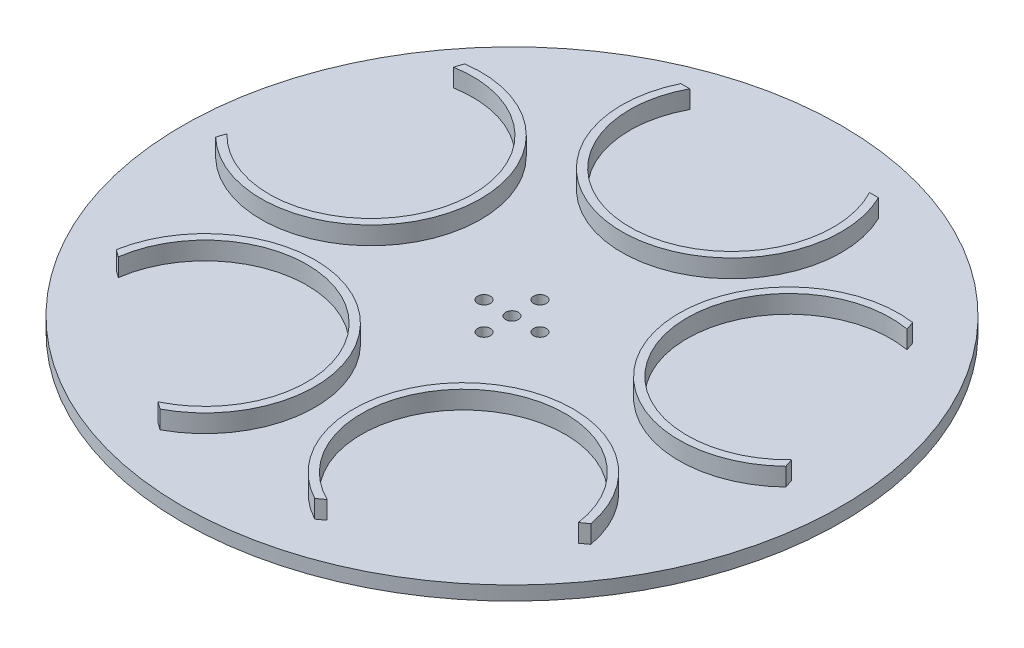
ISO-10303-21;
HEADER;
FILE_DESCRIPTION(('STEP AP214'),'2;1');
FILE_NAME('part.step','',(''),(''),'','','');
FILE_SCHEMA(('AUTOMOTIVE_DESIGN { 1 0 10303 214 1 1 1 1 }'));
ENDSEC;
DATA;
#1=APPLICATION_CONTEXT('core data for automotive mechanical design processes');
#2=APPLICATION_PROTOCOL_DEFINITION('international standard','automotive_design',2000,#1);
#3=PRODUCT_CONTEXT('',#1,'mechanical');
#4=PRODUCT('Part','Part','',(#3));
#5=PRODUCT_RELATED_PRODUCT_CATEGORY('part','',(#4));
#6=PRODUCT_DEFINITION_FORMATION('','',#4);
#7=PRODUCT_DEFINITION_CONTEXT('part definition',#1,'design');
#8=PRODUCT_DEFINITION('design','',#6,#7);
#9=PRODUCT_DEFINITION_SHAPE('','',#8);
#10=(LENGTH_UNIT() NAMED_UNIT(*) SI_UNIT(.MILLI.,.METRE.));
#11=(NAMED_UNIT(*) PLANE_ANGLE_UNIT() SI_UNIT($,.RADIAN.));
#12=(NAMED_UNIT(*) SI_UNIT($,.STERADIAN.) SOLID_ANGLE_UNIT());
#13=UNCERTAINTY_MEASURE_WITH_UNIT(LENGTH_MEASURE(1.E-05),#10,'distance_accuracy_value','');
#14=(GEOMETRIC_REPRESENTATION_CONTEXT(3) GLOBAL_UNCERTAINTY_ASSIGNED_CONTEXT((#13)) GLOBAL_UNIT_ASSIGNED_CONTEXT((#10,
#11,#12)) REPRESENTATION_CONTEXT('',''));
#15=CARTESIAN_POINT('',(0.,0.,0.));
#16=DIRECTION('',(0.,0.,1.));
#17=DIRECTION('',(1.,0.,0.));
#18=AXIS2_PLACEMENT_3D('',#15,#16,#17);
#19=CARTESIAN_POINT('',(0.,3.5,0.));
#20=DIRECTION('',(0.,-1.,0.));
#21=DIRECTION('',(0.,0.,-1.));
#22=AXIS2_PLACEMENT_3D('',#19,#20,#21);
#23=CYLINDRICAL_SURFACE('',#22,82.5);
#24=CARTESIAN_POINT('',(0.,3.5,0.));
#25=DIRECTION('',(0.,1.,0.));
#26=DIRECTION('',(0.,0.,1.));
#27=AXIS2_PLACEMENT_3D('',#24,#25,#26);
#28=CIRCLE('',#27,82.5);
#29=CARTESIAN_POINT('',(0.,3.5,82.5));
#30=VERTEX_POINT('',#29);
#31=EDGE_CURVE('E397',#30,#30,#28,.T.);
#32=ORIENTED_EDGE('',*,*,#31,.F.);
#33=EDGE_LOOP('',(#32));
#34=FACE_BOUND('',#33,.T.);
#35=CARTESIAN_POINT('',(0.,0.,0.));
#36=DIRECTION('',(0.,1.,0.));
#37=DIRECTION('',(0.,0.,1.));
#38=AXIS2_PLACEMENT_3D('',#35,#36,#37);
#39=CIRCLE('',#38,82.5);
#40=CARTESIAN_POINT('',(0.,0.,82.5));
#41=VERTEX_POINT('',#40);
#42=EDGE_CURVE('E385',#41,#41,#39,.T.);
#43=ORIENTED_EDGE('',*,*,#42,.T.);
#44=EDGE_LOOP('',(#43));
#45=FACE_BOUND('',#44,.T.);
#46=ADVANCED_FACE('F127',(#34,#45),#23,.T.);
#47=CARTESIAN_POINT('',(0.,3.5,0.));
#48=DIRECTION('',(0.,-1.,0.));
#49=DIRECTION('',(0.,0.,-1.));
#50=AXIS2_PLACEMENT_3D('',#47,#48,#49);
#51=CYLINDRICAL_SURFACE('',#50,1.60000000000153);
#52=CARTESIAN_POINT('',(0.,3.5,0.));
#53=DIRECTION('',(0.,1.,0.));
#54=DIRECTION('',(0.,0.,1.));
#55=AXIS2_PLACEMENT_3D('',#52,#53,#54);
#56=CIRCLE('',#55,1.60000000000153);
#57=CARTESIAN_POINT('',(0.,3.5,1.60000000000152));
#58=VERTEX_POINT('',#57);
#59=EDGE_CURVE('E394',#58,#58,#56,.T.);
#60=ORIENTED_EDGE('',*,*,#59,.T.);
#61=EDGE_LOOP('',(#60));
#62=FACE_BOUND('',#61,.T.);
#63=CARTESIAN_POINT('',(0.,0.,0.));
#64=DIRECTION('',(0.,1.,0.));
#65=DIRECTION('',(0.,0.,1.));
#66=AXIS2_PLACEMENT_3D('',#63,#64,#65);
#67=CIRCLE('',#66,1.60000000000153);
#68=CARTESIAN_POINT('',(0.,0.,1.60000000000152));
#69=VERTEX_POINT('',#68);
#70=EDGE_CURVE('E412',#69,#69,#67,.T.);
#71=ORIENTED_EDGE('',*,*,#70,.F.);
#72=EDGE_LOOP('',(#71));
#73=FACE_BOUND('',#72,.T.);
#74=ADVANCED_FACE('F476',(#62,#73),#51,.F.);
#75=CARTESIAN_POINT('',(0.,3.5,-7.));
#76=DIRECTION('',(0.,-1.,0.));
#77=DIRECTION('',(0.,0.,-1.));
#78=AXIS2_PLACEMENT_3D('',#75,#76,#77);
#79=CYLINDRICAL_SURFACE('',#78,1.6);
#80=CARTESIAN_POINT('',(0.,3.5,-7.));
#81=DIRECTION('',(0.,1.,0.));
#82=DIRECTION('',(0.,0.,1.));
#83=AXIS2_PLACEMENT_3D('',#80,#81,#82);
#84=CIRCLE('',#83,1.6);
#85=CARTESIAN_POINT('',(0.,3.5,-5.4));
#86=VERTEX_POINT('',#85);
#87=EDGE_CURVE('E391',#86,#86,#84,.T.);
#88=ORIENTED_EDGE('',*,*,#87,.T.);
#89=EDGE_LOOP('',(#88));
#90=FACE_BOUND('',#89,.T.);
#91=CARTESIAN_POINT('',(0.,0.,-7.));
#92=DIRECTION('',(0.,1.,0.));
#93=DIRECTION('',(0.,0.,1.));
#94=AXIS2_PLACEMENT_3D('',#91,#92,#93);
#95=CIRCLE('',#94,1.6);
#96=CARTESIAN_POINT('',(0.,0.,-5.4));
#97=VERTEX_POINT('',#96);
#98=EDGE_CURVE('E409',#97,#97,#95,.T.);
#99=ORIENTED_EDGE('',*,*,#98,.F.);
#100=EDGE_LOOP('',(#99));
#101=FACE_BOUND('',#100,.T.);
#102=ADVANCED_FACE('F482',(#90,#101),#79,.F.);
#103=CARTESIAN_POINT('',(7.,3.5,0.));
#104=DIRECTION('',(0.,-1.,0.));
#105=DIRECTION('',(0.,0.,-1.));
#106=AXIS2_PLACEMENT_3D('',#103,#104,#105);
#107=CYLINDRICAL_SURFACE('',#106,1.6);
#108=CARTESIAN_POINT('',(7.,3.5,0.));
#109=DIRECTION('',(0.,1.,0.));
#110=DIRECTION('',(0.,0.,1.));
#111=AXIS2_PLACEMENT_3D('',#108,#109,#110);
#112=CIRCLE('',#111,1.6);
#113=CARTESIAN_POINT('',(7.,3.5,1.6));
#114=VERTEX_POINT('',#113);
#115=EDGE_CURVE('E388',#114,#114,#112,.T.);
#116=ORIENTED_EDGE('',*,*,#115,.T.);
#117=EDGE_LOOP('',(#116));
#118=FACE_BOUND('',#117,.T.);
#119=CARTESIAN_POINT('',(7.,0.,0.));
#120=DIRECTION('',(0.,1.,0.));
#121=DIRECTION('',(0.,0.,1.));
#122=AXIS2_PLACEMENT_3D('',#119,#120,#121);
#123=CIRCLE('',#122,1.6);
#124=CARTESIAN_POINT('',(7.,0.,1.6));
#125=VERTEX_POINT('',#124);
#126=EDGE_CURVE('E406',#125,#125,#123,.T.);
#127=ORIENTED_EDGE('',*,*,#126,.F.);
#128=EDGE_LOOP('',(#127));
#129=FACE_BOUND('',#128,.T.);
#130=ADVANCED_FACE('F493',(#118,#129),#107,.F.);
#131=CARTESIAN_POINT('',(0.,3.5,7.));
#132=DIRECTION('',(0.,-1.,0.));
#133=DIRECTION('',(0.,0.,-1.));
#134=AXIS2_PLACEMENT_3D('',#131,#132,#133);
#135=CYLINDRICAL_SURFACE('',#134,1.6);
#136=CARTESIAN_POINT('',(0.,3.5,7.));
#137=DIRECTION('',(0.,1.,0.));
#138=DIRECTION('',(0.,0.,1.));
#139=AXIS2_PLACEMENT_3D('',#136,#137,#138);
#140=CIRCLE('',#139,1.6);
#141=CARTESIAN_POINT('',(0.,3.5,8.6));
#142=VERTEX_POINT('',#141);
#143=EDGE_CURVE('E384',#142,#142,#140,.T.);
#144=ORIENTED_EDGE('',*,*,#143,.T.);
#145=EDGE_LOOP('',(#144));
#146=FACE_BOUND('',#145,.T.);
#147=CARTESIAN_POINT('',(0.,0.,7.));
#148=DIRECTION('',(0.,1.,0.));
#149=DIRECTION('',(0.,0.,1.));
#150=AXIS2_PLACEMENT_3D('',#147,#148,#149);
#151=CIRCLE('',#150,1.6);
#152=CARTESIAN_POINT('',(0.,0.,8.6));
#153=VERTEX_POINT('',#152);
#154=EDGE_CURVE('E403',#153,#153,#151,.T.);
#155=ORIENTED_EDGE('',*,*,#154,.F.);
#156=EDGE_LOOP('',(#155));
#157=FACE_BOUND('',#156,.T.);
#158=ADVANCED_FACE('F496',(#146,#157),#135,.F.);
#159=CARTESIAN_POINT('',(-7.,3.5,0.));
#160=DIRECTION('',(0.,-1.,0.));
#161=DIRECTION('',(0.,0.,-1.));
#162=AXIS2_PLACEMENT_3D('',#159,#160,#161);
#163=CYLINDRICAL_SURFACE('',#162,1.6);
#164=CARTESIAN_POINT('',(-7.,3.5,0.));
#165=DIRECTION('',(0.,1.,0.));
#166=DIRECTION('',(0.,0.,1.));
#167=AXIS2_PLACEMENT_3D('',#164,#165,#166);
#168=CIRCLE('',#167,1.6);
#169=CARTESIAN_POINT('',(-7.,3.5,1.6));
#170=VERTEX_POINT('',#169);
#171=EDGE_CURVE('E381',#170,#170,#168,.T.);
#172=ORIENTED_EDGE('',*,*,#171,.T.);
#173=EDGE_LOOP('',(#172));
#174=FACE_BOUND('',#173,.T.);
#175=CARTESIAN_POINT('',(-7.,0.,0.));
#176=DIRECTION('',(0.,1.,0.));
#177=DIRECTION('',(0.,0.,1.));
#178=AXIS2_PLACEMENT_3D('',#175,#176,#177);
#179=CIRCLE('',#178,1.6);
#180=CARTESIAN_POINT('',(-7.,0.,1.6));
#181=VERTEX_POINT('',#180);
#182=EDGE_CURVE('E380',#181,#181,#179,.T.);
#183=ORIENTED_EDGE('',*,*,#182,.F.);
#184=EDGE_LOOP('',(#183));
#185=FACE_BOUND('',#184,.T.);
#186=ADVANCED_FACE('F129',(#174,#185),#163,.F.);
#187=CARTESIAN_POINT('',(0.,0.,0.));
#188=DIRECTION('',(0.,1.,0.));
#189=DIRECTION('',(0.,0.,1.));
#190=AXIS2_PLACEMENT_3D('',#187,#188,#189);
#191=PLANE('',#190);
#192=ORIENTED_EDGE('',*,*,#182,.T.);
#193=EDGE_LOOP('',(#192));
#194=FACE_BOUND('',#193,.T.);
#195=ORIENTED_EDGE('',*,*,#154,.T.);
#196=EDGE_LOOP('',(#195));
#197=FACE_BOUND('',#196,.T.);
#198=ORIENTED_EDGE('',*,*,#126,.T.);
#199=EDGE_LOOP('',(#198));
#200=FACE_BOUND('',#199,.T.);
#201=ORIENTED_EDGE('',*,*,#98,.T.);
#202=EDGE_LOOP('',(#201));
#203=FACE_BOUND('',#202,.T.);
#204=ORIENTED_EDGE('',*,*,#70,.T.);
#205=EDGE_LOOP('',(#204));
#206=FACE_BOUND('',#205,.T.);
#207=ORIENTED_EDGE('',*,*,#42,.F.);
#208=EDGE_LOOP('',(#207));
#209=FACE_BOUND('',#208,.T.);
#210=ADVANCED_FACE('F488',(#194,#197,#200,#203,#206,#209),#191,.F.);
#211=CARTESIAN_POINT('',(0.,3.5,0.));
#212=DIRECTION('',(0.,1.,0.));
#213=DIRECTION('',(0.,0.,1.));
#214=AXIS2_PLACEMENT_3D('',#211,#212,#213);
#215=PLANE('',#214);
#216=CARTESIAN_POINT('',(0.,3.5,-55.));
#217=DIRECTION('',(0.,1.,0.));
#218=DIRECTION('',(0.,0.,1.));
#219=AXIS2_PLACEMENT_3D('',#216,#217,#218);
#220=CIRCLE('',#219,27.5);
#221=CARTESIAN_POINT('',(24.7436860633172,3.5,-67.));
#222=VERTEX_POINT('',#221);
#223=CARTESIAN_POINT('',(-24.7436860633172,3.5,-67.));
#224=VERTEX_POINT('',#223);
#225=EDGE_CURVE('E135',#222,#224,#220,.F.);
#226=ORIENTED_EDGE('',*,*,#225,.T.);
#227=DIRECTION('',(1.,0.,0.));
#228=VECTOR('',#227,1.);
#229=CARTESIAN_POINT('',(4.14412603583616E-13,3.5,-66.9999999999999));
#230=LINE('',#229,#228);
#231=CARTESIAN_POINT('',(-22.5,3.5,-67.));
#232=VERTEX_POINT('',#231);
#233=EDGE_CURVE('E12',#224,#232,#230,.T.);
#234=ORIENTED_EDGE('',*,*,#233,.T.);
#235=CARTESIAN_POINT('',(0.,3.5,-55.));
#236=DIRECTION('',(0.,1.,0.));
#237=DIRECTION('',(0.,0.,1.));
#238=AXIS2_PLACEMENT_3D('',#235,#236,#237);
#239=CIRCLE('',#238,25.5);
#240=CARTESIAN_POINT('',(22.5,3.5,-67.));
#241=VERTEX_POINT('',#240);
#242=EDGE_CURVE('E267',#241,#232,#239,.F.);
#243=ORIENTED_EDGE('',*,*,#242,.F.);
#244=DIRECTION('',(-1.,0.,0.));
#245=VECTOR('',#244,1.);
#246=CARTESIAN_POINT('',(-4.14412603583616E-13,3.5,-66.9999999999999));
#247=LINE('',#246,#245);
#248=EDGE_CURVE('E145',#222,#241,#247,.T.);
#249=ORIENTED_EDGE('',*,*,#248,.F.);
#250=EDGE_LOOP('',(#226,#234,#243,#249));
#251=FACE_BOUND('',#250,.T.);
#252=CARTESIAN_POINT('',(52.308108396234,3.5,-16.9959346906204));
#253=DIRECTION('',(0.,1.,0.));
#254=DIRECTION('',(0.,0.,1.));
#255=AXIS2_PLACEMENT_3D('',#252,#253,#254);
#256=CIRCLE('',#255,27.5);
#257=CARTESIAN_POINT('',(71.3670060888188,3.5,2.82850524456022));
#258=VERTEX_POINT('',#257);
#259=CARTESIAN_POINT('',(56.0745670947332,3.5,-44.2367824907991));
#260=VERTEX_POINT('',#259);
#261=EDGE_CURVE('E452',#258,#260,#256,.F.);
#262=ORIENTED_EDGE('',*,*,#261,.T.);
#263=DIRECTION('',(0.309016994374912,0.,0.951056516295165));
#264=VECTOR('',#263,1.);
#265=CARTESIAN_POINT('',(63.720786591776,3.5,-20.7041386231191));
#266=LINE('',#265,#264);
#267=CARTESIAN_POINT('',(56.7679042183403,3.5,-42.1029102397606));
#268=VERTEX_POINT('',#267);
#269=EDGE_CURVE('E454',#260,#268,#266,.T.);
#270=ORIENTED_EDGE('',*,*,#269,.T.);
#271=CARTESIAN_POINT('',(52.308108396234,3.5,-16.9959346906204));
#272=DIRECTION('',(0.,1.,0.));
#273=DIRECTION('',(0.,0.,1.));
#274=AXIS2_PLACEMENT_3D('',#271,#272,#273);
#275=CIRCLE('',#274,25.5);
#276=CARTESIAN_POINT('',(70.6736689652116,3.5,0.694632993521731));
#277=VERTEX_POINT('',#276);
#278=EDGE_CURVE('E446',#277,#268,#275,.F.);
#279=ORIENTED_EDGE('',*,*,#278,.F.);
#280=DIRECTION('',(-0.309016994374924,0.,-0.951056516295161));
#281=VECTOR('',#280,1.);
#282=CARTESIAN_POINT('',(63.7207865917757,3.5,-20.7041386231199));
#283=LINE('',#282,#281);
#284=EDGE_CURVE('E449',#258,#277,#283,.T.);
#285=ORIENTED_EDGE('',*,*,#284,.F.);
#286=EDGE_LOOP('',(#262,#270,#279,#285));
#287=FACE_BOUND('',#286,.T.);
#288=CARTESIAN_POINT('',(-32.3281888760903,3.5,44.495934690619));
#289=DIRECTION('',(0.,1.,0.));
#290=DIRECTION('',(0.,0.,1.));
#291=AXIS2_PLACEMENT_3D('',#288,#289,#290);
#292=CIRCLE('',#291,27.5);
#293=CARTESIAN_POINT('',(-59.3996744323017,3.5,39.6601648677431));
#294=VERTEX_POINT('',#293);
#295=CARTESIAN_POINT('',(-19.3635493749001,3.5,68.7481123784923));
#296=VERTEX_POINT('',#295);
#297=EDGE_CURVE('E442',#294,#296,#292,.F.);
#298=ORIENTED_EDGE('',*,*,#297,.T.);
#299=DIRECTION('',(-0.809016994374885,0.,-0.587785252292558));
#300=VECTOR('',#299,1.);
#301=CARTESIAN_POINT('',(-39.3816119036013,3.5,54.2041386231172));
#302=LINE('',#301,#300);
#303=CARTESIAN_POINT('',(-21.1787295301658,3.5,67.4293067997001));
#304=VERTEX_POINT('',#303);
#305=EDGE_CURVE('E444',#296,#304,#302,.T.);
#306=ORIENTED_EDGE('',*,*,#305,.T.);
#307=CARTESIAN_POINT('',(-32.3281888760903,3.5,44.495934690619));
#308=DIRECTION('',(0.,1.,0.));
#309=DIRECTION('',(0.,0.,1.));
#310=AXIS2_PLACEMENT_3D('',#307,#308,#309);
#311=CIRCLE('',#310,25.5);
#312=CARTESIAN_POINT('',(-57.584494277036,3.5,40.9789704465353));
#313=VERTEX_POINT('',#312);
#314=EDGE_CURVE('E436',#313,#304,#311,.F.);
#315=ORIENTED_EDGE('',*,*,#314,.F.);
#316=DIRECTION('',(0.809016994374897,0.,0.587785252292542));
#317=VECTOR('',#316,1.);
#318=CARTESIAN_POINT('',(-39.3816119036002,3.5,54.2041386231179));
#319=LINE('',#318,#317);
#320=EDGE_CURVE('E439',#294,#313,#319,.T.);
#321=ORIENTED_EDGE('',*,*,#320,.F.);
#322=EDGE_LOOP('',(#298,#306,#315,#321));
#323=FACE_BOUND('',#322,.T.);
#324=CARTESIAN_POINT('',(-52.3081083962313,3.5,-16.9959346906288));
#325=DIRECTION('',(0.,1.,0.));
#326=DIRECTION('',(0.,0.,1.));
#327=AXIS2_PLACEMENT_3D('',#324,#325,#326);
#328=CIRCLE('',#327,27.5);
#329=CARTESIAN_POINT('',(-56.0745670947261,3.5,-44.2367824908081));
#330=VERTEX_POINT('',#329);
#331=CARTESIAN_POINT('',(-71.3670060888192,3.5,2.82850524454883));
#332=VERTEX_POINT('',#331);
#333=EDGE_CURVE('E432',#330,#332,#328,.F.);
#334=ORIENTED_EDGE('',*,*,#333,.T.);
#335=DIRECTION('',(0.309016994375073,0.,-0.951056516295113));
#336=VECTOR('',#335,1.);
#337=CARTESIAN_POINT('',(-63.7207865917725,3.5,-20.7041386231299));
#338=LINE('',#337,#336);
#339=CARTESIAN_POINT('',(-70.6736689652117,3.5,0.694632993510445));
#340=VERTEX_POINT('',#339);
#341=EDGE_CURVE('E434',#332,#340,#338,.T.);
#342=ORIENTED_EDGE('',*,*,#341,.T.);
#343=CARTESIAN_POINT('',(-52.3081083962313,3.5,-16.9959346906288));
#344=DIRECTION('',(0.,1.,0.));
#345=DIRECTION('',(0.,0.,1.));
#346=AXIS2_PLACEMENT_3D('',#343,#344,#345);
#347=CIRCLE('',#346,25.5);
#348=CARTESIAN_POINT('',(-56.7679042183336,3.5,-42.1029102397697));
#349=VERTEX_POINT('',#348);
#350=EDGE_CURVE('E426',#349,#340,#347,.F.);
#351=ORIENTED_EDGE('',*,*,#350,.F.);
#352=DIRECTION('',(-0.309016994375063,0.,0.951056516295116));
#353=VECTOR('',#352,1.);
#354=CARTESIAN_POINT('',(-63.7207865917727,3.5,-20.7041386231291));
#355=LINE('',#354,#353);
#356=EDGE_CURVE('E429',#330,#349,#355,.T.);
#357=ORIENTED_EDGE('',*,*,#356,.F.);
#358=EDGE_LOOP('',(#334,#342,#351,#357));
#359=FACE_BOUND('',#358,.T.);
#360=CARTESIAN_POINT('',(32.3281888760832,3.5,44.4959346906242));
#361=DIRECTION('',(0.,1.,0.));
#362=DIRECTION('',(0.,0.,1.));
#363=AXIS2_PLACEMENT_3D('',#360,#361,#362);
#364=CIRCLE('',#363,25.5);
#365=CARTESIAN_POINT('',(21.1787295301551,3.5,67.4293067997035));
#366=VERTEX_POINT('',#365);
#367=CARTESIAN_POINT('',(57.5844942770294,3.5,40.9789704465445));
#368=VERTEX_POINT('',#367);
#369=EDGE_CURVE('E423',#366,#368,#364,.F.);
#370=ORIENTED_EDGE('',*,*,#369,.F.);
#371=DIRECTION('',(0.809016994374984,0.,-0.587785252292423));
#372=VECTOR('',#371,1.);
#373=CARTESIAN_POINT('',(39.3816119035923,3.5,54.2041386231239));
#374=LINE('',#373,#372);
#375=CARTESIAN_POINT('',(19.3635493748891,3.5,68.7481123784954));
#376=VERTEX_POINT('',#375);
#377=EDGE_CURVE('E400',#376,#366,#374,.T.);
#378=ORIENTED_EDGE('',*,*,#377,.F.);
#379=CARTESIAN_POINT('',(32.3281888760832,3.5,44.4959346906242));
#380=DIRECTION('',(0.,1.,0.));
#381=DIRECTION('',(0.,0.,1.));
#382=AXIS2_PLACEMENT_3D('',#379,#380,#381);
#383=CIRCLE('',#382,27.5);
#384=CARTESIAN_POINT('',(59.3996744322954,3.5,39.6601648677526));
#385=VERTEX_POINT('',#384);
#386=EDGE_CURVE('E419',#376,#385,#383,.F.);
#387=ORIENTED_EDGE('',*,*,#386,.T.);
#388=DIRECTION('',(-0.809016994374987,0.,0.587785252292419));
#389=VECTOR('',#388,1.);
#390=CARTESIAN_POINT('',(39.381611903592,3.5,54.2041386231241));
#391=LINE('',#390,#389);
#392=EDGE_CURVE('E421',#385,#368,#391,.T.);
#393=ORIENTED_EDGE('',*,*,#392,.T.);
#394=EDGE_LOOP('',(#370,#378,#387,#393));
#395=FACE_BOUND('',#394,.T.);
#396=ORIENTED_EDGE('',*,*,#171,.F.);
#397=EDGE_LOOP('',(#396));
#398=FACE_BOUND('',#397,.T.);
#399=ORIENTED_EDGE('',*,*,#143,.F.);
#400=EDGE_LOOP('',(#399));
#401=FACE_BOUND('',#400,.T.);
#402=ORIENTED_EDGE('',*,*,#115,.F.);
#403=EDGE_LOOP('',(#402));
#404=FACE_BOUND('',#403,.T.);
#405=ORIENTED_EDGE('',*,*,#87,.F.);
#406=EDGE_LOOP('',(#405));
#407=FACE_BOUND('',#406,.T.);
#408=ORIENTED_EDGE('',*,*,#59,.F.);
#409=EDGE_LOOP('',(#408));
#410=FACE_BOUND('',#409,.T.);
#411=ORIENTED_EDGE('',*,*,#31,.T.);
#412=EDGE_LOOP('',(#411));
#413=FACE_BOUND('',#412,.T.);
#414=ADVANCED_FACE('F510',(#251,#287,#323,#359,#395,#398,#401,#404,#407,#410,#413),#215,.T.);
#415=CARTESIAN_POINT('',(32.3281888760832,8.,44.4959346906242));
#416=DIRECTION('',(0.,-1.,0.));
#417=DIRECTION('',(0.,0.,-1.));
#418=AXIS2_PLACEMENT_3D('',#415,#416,#417);
#419=CYLINDRICAL_SURFACE('',#418,25.5);
#420=DIRECTION('',(0.,-1.,0.));
#421=VECTOR('',#420,1.);
#422=CARTESIAN_POINT('',(21.1787295301551,8.,67.4293067997035));
#423=LINE('',#422,#421);
#424=CARTESIAN_POINT('',(21.1787295301551,8.,67.4293067997035));
#425=VERTEX_POINT('',#424);
#426=EDGE_CURVE('E368',#425,#366,#423,.T.);
#427=ORIENTED_EDGE('',*,*,#426,.T.);
#428=ORIENTED_EDGE('',*,*,#369,.T.);
#429=DIRECTION('',(0.,-1.,0.));
#430=VECTOR('',#429,1.);
#431=CARTESIAN_POINT('',(57.5844942770294,8.,40.9789704465445));
#432=LINE('',#431,#430);
#433=CARTESIAN_POINT('',(57.5844942770294,8.,40.9789704465445));
#434=VERTEX_POINT('',#433);
#435=EDGE_CURVE('E377',#434,#368,#432,.T.);
#436=ORIENTED_EDGE('',*,*,#435,.F.);
#437=CARTESIAN_POINT('',(32.3281888760832,8.,44.4959346906242));
#438=DIRECTION('',(0.,1.,0.));
#439=DIRECTION('',(0.,0.,1.));
#440=AXIS2_PLACEMENT_3D('',#437,#438,#439);
#441=CIRCLE('',#440,25.5);
#442=EDGE_CURVE('E358',#434,#425,#441,.T.);
#443=ORIENTED_EDGE('',*,*,#442,.T.);
#444=EDGE_LOOP('',(#427,#428,#436,#443));
#445=FACE_BOUND('',#444,.T.);
#446=ADVANCED_FACE('F525',(#445),#419,.F.);
#447=CARTESIAN_POINT('',(39.381611903592,8.,54.2041386231241));
#448=DIRECTION('',(-0.587785252292419,0.,-0.809016994374987));
#449=DIRECTION('',(-0.809016994374987,0.,0.587785252292419));
#450=AXIS2_PLACEMENT_3D('',#447,#448,#449);
#451=PLANE('',#450);
#452=ORIENTED_EDGE('',*,*,#392,.F.);
#453=DIRECTION('',(0.,-1.,0.));
#454=VECTOR('',#453,1.);
#455=CARTESIAN_POINT('',(59.3996744322954,8.,39.6601648677526));
#456=LINE('',#455,#454);
#457=CARTESIAN_POINT('',(59.3996744322954,8.,39.6601648677526));
#458=VERTEX_POINT('',#457);
#459=EDGE_CURVE('E374',#458,#385,#456,.T.);
#460=ORIENTED_EDGE('',*,*,#459,.F.);
#461=DIRECTION('',(0.809016994374987,0.,-0.587785252292419));
#462=VECTOR('',#461,1.);
#463=CARTESIAN_POINT('',(39.381611903592,8.,54.2041386231241));
#464=LINE('',#463,#462);
#465=EDGE_CURVE('E361',#434,#458,#464,.T.);
#466=ORIENTED_EDGE('',*,*,#465,.F.);
#467=ORIENTED_EDGE('',*,*,#435,.T.);
#468=EDGE_LOOP('',(#452,#460,#466,#467));
#469=FACE_BOUND('',#468,.T.);
#470=ADVANCED_FACE('F531',(#469),#451,.F.);
#471=CARTESIAN_POINT('',(32.3281888760832,8.,44.4959346906242));
#472=DIRECTION('',(0.,-1.,0.));
#473=DIRECTION('',(0.,0.,-1.));
#474=AXIS2_PLACEMENT_3D('',#471,#472,#473);
#475=CYLINDRICAL_SURFACE('',#474,27.5);
#476=ORIENTED_EDGE('',*,*,#386,.F.);
#477=DIRECTION('',(0.,-1.,0.));
#478=VECTOR('',#477,1.);
#479=CARTESIAN_POINT('',(19.3635493748892,8.,68.7481123784954));
#480=LINE('',#479,#478);
#481=CARTESIAN_POINT('',(19.3635493748892,8.,68.7481123784954));
#482=VERTEX_POINT('',#481);
#483=EDGE_CURVE('E371',#482,#376,#480,.T.);
#484=ORIENTED_EDGE('',*,*,#483,.F.);
#485=CARTESIAN_POINT('',(32.3281888760832,8.,44.4959346906242));
#486=DIRECTION('',(0.,1.,0.));
#487=DIRECTION('',(0.,0.,1.));
#488=AXIS2_PLACEMENT_3D('',#485,#486,#487);
#489=CIRCLE('',#488,27.5);
#490=EDGE_CURVE('E363',#458,#482,#489,.T.);
#491=ORIENTED_EDGE('',*,*,#490,.F.);
#492=ORIENTED_EDGE('',*,*,#459,.T.);
#493=EDGE_LOOP('',(#476,#484,#491,#492));
#494=FACE_BOUND('',#493,.T.);
#495=ADVANCED_FACE('F538',(#494),#475,.T.);
#496=CARTESIAN_POINT('',(39.3816119035923,8.,54.2041386231239));
#497=DIRECTION('',(0.587785252292423,0.,0.809016994374984));
#498=DIRECTION('',(0.809016994374984,0.,-0.587785252292423));
#499=AXIS2_PLACEMENT_3D('',#496,#497,#498);
#500=PLANE('',#499);
#501=ORIENTED_EDGE('',*,*,#483,.T.);
#502=ORIENTED_EDGE('',*,*,#377,.T.);
#503=ORIENTED_EDGE('',*,*,#426,.F.);
#504=DIRECTION('',(-0.809016994374984,0.,0.587785252292423));
#505=VECTOR('',#504,1.);
#506=CARTESIAN_POINT('',(39.3816119035923,8.,54.2041386231239));
#507=LINE('',#506,#505);
#508=EDGE_CURVE('E365',#425,#482,#507,.T.);
#509=ORIENTED_EDGE('',*,*,#508,.T.);
#510=EDGE_LOOP('',(#501,#502,#503,#509));
#511=FACE_BOUND('',#510,.T.);
#512=ADVANCED_FACE('F542',(#511),#500,.T.);
#513=CARTESIAN_POINT('',(0.,8.,0.));
#514=DIRECTION('',(0.,1.,0.));
#515=DIRECTION('',(0.,0.,1.));
#516=AXIS2_PLACEMENT_3D('',#513,#514,#515);
#517=PLANE('',#516);
#518=ORIENTED_EDGE('',*,*,#442,.F.);
#519=ORIENTED_EDGE('',*,*,#465,.T.);
#520=ORIENTED_EDGE('',*,*,#490,.T.);
#521=ORIENTED_EDGE('',*,*,#508,.F.);
#522=EDGE_LOOP('',(#518,#519,#520,#521));
#523=FACE_BOUND('',#522,.T.);
#524=ADVANCED_FACE('F546',(#523),#517,.T.);
#525=CARTESIAN_POINT('',(-70.6736689652117,8.,0.694632993510448));
#526=DIRECTION('',(0.951056516295113,0.,0.309016994375073));
#527=DIRECTION('',(0.309016994375073,0.,-0.951056516295113));
#528=AXIS2_PLACEMENT_3D('',#525,#526,#527);
#529=PLANE('',#528);
#530=ORIENTED_EDGE('',*,*,#341,.F.);
#531=DIRECTION('',(0.,-1.,0.));
#532=VECTOR('',#531,1.);
#533=CARTESIAN_POINT('',(-71.3670060888192,8.,2.82850524454883));
#534=LINE('',#533,#532);
#535=CARTESIAN_POINT('',(-71.3670060888192,8.,2.82850524454883));
#536=VERTEX_POINT('',#535);
#537=EDGE_CURVE('E335',#536,#332,#534,.T.);
#538=ORIENTED_EDGE('',*,*,#537,.F.);
#539=DIRECTION('',(-0.309016994375073,0.,0.951056516295113));
#540=VECTOR('',#539,1.);
#541=CARTESIAN_POINT('',(-70.6736689652117,8.,0.694632993510448));
#542=LINE('',#541,#540);
#543=CARTESIAN_POINT('',(-70.6736689652117,8.,0.694632993510445));
#544=VERTEX_POINT('',#543);
#545=EDGE_CURVE('E355',#544,#536,#542,.T.);
#546=ORIENTED_EDGE('',*,*,#545,.F.);
#547=DIRECTION('',(0.,-1.,0.));
#548=VECTOR('',#547,1.);
#549=CARTESIAN_POINT('',(-70.6736689652117,8.,0.694632993510445));
#550=LINE('',#549,#548);
#551=EDGE_CURVE('E344',#544,#340,#550,.T.);
#552=ORIENTED_EDGE('',*,*,#551,.T.);
#553=EDGE_LOOP('',(#530,#538,#546,#552));
#554=FACE_BOUND('',#553,.T.);
#555=ADVANCED_FACE('F550',(#554),#529,.F.);
#556=CARTESIAN_POINT('',(-52.3081083962313,8.,-16.9959346906288));
#557=DIRECTION('',(0.,-1.,0.));
#558=DIRECTION('',(0.,0.,-1.));
#559=AXIS2_PLACEMENT_3D('',#556,#557,#558);
#560=CYLINDRICAL_SURFACE('',#559,27.5);
#561=ORIENTED_EDGE('',*,*,#333,.F.);
#562=DIRECTION('',(0.,-1.,0.));
#563=VECTOR('',#562,1.);
#564=CARTESIAN_POINT('',(-56.0745670947261,8.,-44.2367824908081));
#565=LINE('',#564,#563);
#566=CARTESIAN_POINT('',(-56.0745670947261,8.,-44.2367824908081));
#567=VERTEX_POINT('',#566);
#568=EDGE_CURVE('E338',#567,#330,#565,.T.);
#569=ORIENTED_EDGE('',*,*,#568,.F.);
#570=CARTESIAN_POINT('',(-52.3081083962313,8.,-16.9959346906288));
#571=DIRECTION('',(0.,1.,0.));
#572=DIRECTION('',(0.,0.,1.));
#573=AXIS2_PLACEMENT_3D('',#570,#571,#572);
#574=CIRCLE('',#573,27.5);
#575=EDGE_CURVE('E353',#536,#567,#574,.T.);
#576=ORIENTED_EDGE('',*,*,#575,.F.);
#577=ORIENTED_EDGE('',*,*,#537,.T.);
#578=EDGE_LOOP('',(#561,#569,#576,#577));
#579=FACE_BOUND('',#578,.T.);
#580=ADVANCED_FACE('F564',(#579),#560,.T.);
#581=CARTESIAN_POINT('',(-56.7679042183336,8.,-42.1029102397697));
#582=DIRECTION('',(-0.951056516295116,0.,-0.309016994375063));
#583=DIRECTION('',(-0.309016994375063,0.,0.951056516295116));
#584=AXIS2_PLACEMENT_3D('',#581,#582,#583);
#585=PLANE('',#584);
#586=ORIENTED_EDGE('',*,*,#568,.T.);
#587=ORIENTED_EDGE('',*,*,#356,.T.);
#588=DIRECTION('',(0.,-1.,0.));
#589=VECTOR('',#588,1.);
#590=CARTESIAN_POINT('',(-56.7679042183336,8.,-42.1029102397697));
#591=LINE('',#590,#589);
#592=CARTESIAN_POINT('',(-56.7679042183336,8.,-42.1029102397697));
#593=VERTEX_POINT('',#592);
#594=EDGE_CURVE('E341',#593,#349,#591,.T.);
#595=ORIENTED_EDGE('',*,*,#594,.F.);
#596=DIRECTION('',(0.309016994375063,0.,-0.951056516295116));
#597=VECTOR('',#596,1.);
#598=CARTESIAN_POINT('',(-56.7679042183336,8.,-42.1029102397697));
#599=LINE('',#598,#597);
#600=EDGE_CURVE('E350',#593,#567,#599,.T.);
#601=ORIENTED_EDGE('',*,*,#600,.T.);
#602=EDGE_LOOP('',(#586,#587,#595,#601));
#603=FACE_BOUND('',#602,.T.);
#604=ADVANCED_FACE('F560',(#603),#585,.T.);
#605=CARTESIAN_POINT('',(-52.3081083962313,8.,-16.9959346906288));
#606=DIRECTION('',(0.,-1.,0.));
#607=DIRECTION('',(0.,0.,-1.));
#608=AXIS2_PLACEMENT_3D('',#605,#606,#607);
#609=CYLINDRICAL_SURFACE('',#608,25.5);
#610=ORIENTED_EDGE('',*,*,#594,.T.);
#611=ORIENTED_EDGE('',*,*,#350,.T.);
#612=ORIENTED_EDGE('',*,*,#551,.F.);
#613=CARTESIAN_POINT('',(-52.3081083962313,8.,-16.9959346906288));
#614=DIRECTION('',(0.,1.,0.));
#615=DIRECTION('',(0.,0.,1.));
#616=AXIS2_PLACEMENT_3D('',#613,#614,#615);
#617=CIRCLE('',#616,25.5);
#618=EDGE_CURVE('E347',#544,#593,#617,.T.);
#619=ORIENTED_EDGE('',*,*,#618,.T.);
#620=EDGE_LOOP('',(#610,#611,#612,#619));
#621=FACE_BOUND('',#620,.T.);
#622=ADVANCED_FACE('F556',(#621),#609,.F.);
#623=CARTESIAN_POINT('',(-52.3081083962313,8.,-16.9959346906288));
#624=DIRECTION('',(0.,1.,0.));
#625=DIRECTION('',(0.,0.,1.));
#626=AXIS2_PLACEMENT_3D('',#623,#624,#625);
#627=PLANE('',#626);
#628=ORIENTED_EDGE('',*,*,#545,.T.);
#629=ORIENTED_EDGE('',*,*,#575,.T.);
#630=ORIENTED_EDGE('',*,*,#600,.F.);
#631=ORIENTED_EDGE('',*,*,#618,.F.);
#632=EDGE_LOOP('',(#628,#629,#630,#631));
#633=FACE_BOUND('',#632,.T.);
#634=ADVANCED_FACE('F552',(#633),#627,.T.);
#635=CARTESIAN_POINT('',(-21.1787295301658,8.,67.4293067997001));
#636=DIRECTION('',(0.587785252292559,0.,-0.809016994374886));
#637=DIRECTION('',(-0.809016994374885,0.,-0.587785252292558));
#638=AXIS2_PLACEMENT_3D('',#635,#636,#637);
#639=PLANE('',#638);
#640=ORIENTED_EDGE('',*,*,#305,.F.);
#641=DIRECTION('',(0.,-1.,0.));
#642=VECTOR('',#641,1.);
#643=CARTESIAN_POINT('',(-19.3635493749001,8.,68.7481123784923));
#644=LINE('',#643,#642);
#645=CARTESIAN_POINT('',(-19.3635493749001,8.,68.7481123784923));
#646=VERTEX_POINT('',#645);
#647=EDGE_CURVE('E312',#646,#296,#644,.T.);
#648=ORIENTED_EDGE('',*,*,#647,.F.);
#649=DIRECTION('',(0.809016994374886,0.,0.587785252292559));
#650=VECTOR('',#649,1.);
#651=CARTESIAN_POINT('',(-21.1787295301658,8.,67.4293067997001));
#652=LINE('',#651,#650);
#653=CARTESIAN_POINT('',(-21.1787295301658,8.,67.4293067997001));
#654=VERTEX_POINT('',#653);
#655=EDGE_CURVE('E332',#654,#646,#652,.T.);
#656=ORIENTED_EDGE('',*,*,#655,.F.);
#657=DIRECTION('',(0.,-1.,0.));
#658=VECTOR('',#657,1.);
#659=CARTESIAN_POINT('',(-21.1787295301658,8.,67.4293067997001));
#660=LINE('',#659,#658);
#661=EDGE_CURVE('E321',#654,#304,#660,.T.);
#662=ORIENTED_EDGE('',*,*,#661,.T.);
#663=EDGE_LOOP('',(#640,#648,#656,#662));
#664=FACE_BOUND('',#663,.T.);
#665=ADVANCED_FACE('F555',(#664),#639,.F.);
#666=CARTESIAN_POINT('',(-32.3281888760903,8.,44.495934690619));
#667=DIRECTION('',(0.,-1.,0.));
#668=DIRECTION('',(0.,0.,-1.));
#669=AXIS2_PLACEMENT_3D('',#666,#667,#668);
#670=CYLINDRICAL_SURFACE('',#669,27.5);
#671=ORIENTED_EDGE('',*,*,#297,.F.);
#672=DIRECTION('',(0.,-1.,0.));
#673=VECTOR('',#672,1.);
#674=CARTESIAN_POINT('',(-59.3996744323017,8.,39.6601648677432));
#675=LINE('',#674,#673);
#676=CARTESIAN_POINT('',(-59.3996744323017,8.,39.6601648677432));
#677=VERTEX_POINT('',#676);
#678=EDGE_CURVE('E315',#677,#294,#675,.T.);
#679=ORIENTED_EDGE('',*,*,#678,.F.);
#680=CARTESIAN_POINT('',(-32.3281888760903,8.,44.495934690619));
#681=DIRECTION('',(0.,1.,0.));
#682=DIRECTION('',(0.,0.,1.));
#683=AXIS2_PLACEMENT_3D('',#680,#681,#682);
#684=CIRCLE('',#683,27.5);
#685=EDGE_CURVE('E330',#646,#677,#684,.T.);
#686=ORIENTED_EDGE('',*,*,#685,.F.);
#687=ORIENTED_EDGE('',*,*,#647,.T.);
#688=EDGE_LOOP('',(#671,#679,#686,#687));
#689=FACE_BOUND('',#688,.T.);
#690=ADVANCED_FACE('F584',(#689),#670,.T.);
#691=CARTESIAN_POINT('',(-57.584494277036,8.,40.9789704465353));
#692=DIRECTION('',(-0.587785252292542,0.,0.809016994374897));
#693=DIRECTION('',(0.809016994374897,0.,0.587785252292542));
#694=AXIS2_PLACEMENT_3D('',#691,#692,#693);
#695=PLANE('',#694);
#696=ORIENTED_EDGE('',*,*,#678,.T.);
#697=ORIENTED_EDGE('',*,*,#320,.T.);
#698=DIRECTION('',(0.,-1.,0.));
#699=VECTOR('',#698,1.);
#700=CARTESIAN_POINT('',(-57.584494277036,8.,40.9789704465353));
#701=LINE('',#700,#699);
#702=CARTESIAN_POINT('',(-57.584494277036,8.,40.9789704465353));
#703=VERTEX_POINT('',#702);
#704=EDGE_CURVE('E318',#703,#313,#701,.T.);
#705=ORIENTED_EDGE('',*,*,#704,.F.);
#706=DIRECTION('',(-0.809016994374897,0.,-0.587785252292542));
#707=VECTOR('',#706,1.);
#708=CARTESIAN_POINT('',(-57.584494277036,8.,40.9789704465353));
#709=LINE('',#708,#707);
#710=EDGE_CURVE('E327',#703,#677,#709,.T.);
#711=ORIENTED_EDGE('',*,*,#710,.T.);
#712=EDGE_LOOP('',(#696,#697,#705,#711));
#713=FACE_BOUND('',#712,.T.);
#714=ADVANCED_FACE('F580',(#713),#695,.T.);
#715=CARTESIAN_POINT('',(-32.3281888760903,8.,44.495934690619));
#716=DIRECTION('',(0.,-1.,0.));
#717=DIRECTION('',(0.,0.,-1.));
#718=AXIS2_PLACEMENT_3D('',#715,#716,#717);
#719=CYLINDRICAL_SURFACE('',#718,25.5);
#720=ORIENTED_EDGE('',*,*,#704,.T.);
#721=ORIENTED_EDGE('',*,*,#314,.T.);
#722=ORIENTED_EDGE('',*,*,#661,.F.);
#723=CARTESIAN_POINT('',(-32.3281888760903,8.,44.495934690619));
#724=DIRECTION('',(0.,1.,0.));
#725=DIRECTION('',(0.,0.,1.));
#726=AXIS2_PLACEMENT_3D('',#723,#724,#725);
#727=CIRCLE('',#726,25.5);
#728=EDGE_CURVE('E324',#654,#703,#727,.T.);
#729=ORIENTED_EDGE('',*,*,#728,.T.);
#730=EDGE_LOOP('',(#720,#721,#722,#729));
#731=FACE_BOUND('',#730,.T.);
#732=ADVANCED_FACE('F576',(#731),#719,.F.);
#733=CARTESIAN_POINT('',(-32.3281888760903,8.,44.495934690619));
#734=DIRECTION('',(0.,1.,0.));
#735=DIRECTION('',(0.,0.,1.));
#736=AXIS2_PLACEMENT_3D('',#733,#734,#735);
#737=PLANE('',#736);
#738=ORIENTED_EDGE('',*,*,#655,.T.);
#739=ORIENTED_EDGE('',*,*,#685,.T.);
#740=ORIENTED_EDGE('',*,*,#710,.F.);
#741=ORIENTED_EDGE('',*,*,#728,.F.);
#742=EDGE_LOOP('',(#738,#739,#740,#741));
#743=FACE_BOUND('',#742,.T.);
#744=ADVANCED_FACE('F572',(#743),#737,.T.);
#745=CARTESIAN_POINT('',(56.7679042183403,8.,-42.1029102397606));
#746=DIRECTION('',(-0.951056516295165,0.,0.309016994374912));
#747=DIRECTION('',(0.309016994374912,0.,0.951056516295165));
#748=AXIS2_PLACEMENT_3D('',#745,#746,#747);
#749=PLANE('',#748);
#750=ORIENTED_EDGE('',*,*,#269,.F.);
#751=DIRECTION('',(0.,-1.,0.));
#752=VECTOR('',#751,1.);
#753=CARTESIAN_POINT('',(56.0745670947332,8.,-44.2367824907991));
#754=LINE('',#753,#752);
#755=CARTESIAN_POINT('',(56.0745670947332,8.,-44.2367824907991));
#756=VERTEX_POINT('',#755);
#757=EDGE_CURVE('E278',#756,#260,#754,.T.);
#758=ORIENTED_EDGE('',*,*,#757,.F.);
#759=DIRECTION('',(-0.309016994374912,0.,-0.951056516295165));
#760=VECTOR('',#759,1.);
#761=CARTESIAN_POINT('',(56.7679042183403,8.,-42.1029102397606));
#762=LINE('',#761,#760);
#763=CARTESIAN_POINT('',(56.7679042183403,8.,-42.1029102397606));
#764=VERTEX_POINT('',#763);
#765=EDGE_CURVE('E309',#764,#756,#762,.T.);
#766=ORIENTED_EDGE('',*,*,#765,.F.);
#767=DIRECTION('',(0.,-1.,0.));
#768=VECTOR('',#767,1.);
#769=CARTESIAN_POINT('',(56.7679042183403,8.,-42.1029102397606));
#770=LINE('',#769,#768);
#771=EDGE_CURVE('E298',#764,#268,#770,.T.);
#772=ORIENTED_EDGE('',*,*,#771,.T.);
#773=EDGE_LOOP('',(#750,#758,#766,#772));
#774=FACE_BOUND('',#773,.T.);
#775=ADVANCED_FACE('F575',(#774),#749,.F.);
#776=CARTESIAN_POINT('',(52.308108396234,8.,-16.9959346906204));
#777=DIRECTION('',(0.,-1.,0.));
#778=DIRECTION('',(0.,0.,-1.));
#779=AXIS2_PLACEMENT_3D('',#776,#777,#778);
#780=CYLINDRICAL_SURFACE('',#779,27.5);
#781=ORIENTED_EDGE('',*,*,#261,.F.);
#782=DIRECTION('',(0.,-1.,0.));
#783=VECTOR('',#782,1.);
#784=CARTESIAN_POINT('',(71.3670060888188,8.,2.82850524456021));
#785=LINE('',#784,#783);
#786=CARTESIAN_POINT('',(71.3670060888188,8.,2.82850524456021));
#787=VERTEX_POINT('',#786);
#788=EDGE_CURVE('E292',#787,#258,#785,.T.);
#789=ORIENTED_EDGE('',*,*,#788,.F.);
#790=CARTESIAN_POINT('',(52.308108396234,8.,-16.9959346906204));
#791=DIRECTION('',(0.,1.,0.));
#792=DIRECTION('',(0.,0.,1.));
#793=AXIS2_PLACEMENT_3D('',#790,#791,#792);
#794=CIRCLE('',#793,27.5);
#795=EDGE_CURVE('E307',#756,#787,#794,.T.);
#796=ORIENTED_EDGE('',*,*,#795,.F.);
#797=ORIENTED_EDGE('',*,*,#757,.T.);
#798=EDGE_LOOP('',(#781,#789,#796,#797));
#799=FACE_BOUND('',#798,.T.);
#800=ADVANCED_FACE('F602',(#799),#780,.T.);
#801=CARTESIAN_POINT('',(70.6736689652116,8.,0.694632993521724));
#802=DIRECTION('',(0.951056516295161,0.,-0.309016994374924));
#803=DIRECTION('',(-0.309016994374924,0.,-0.951056516295161));
#804=AXIS2_PLACEMENT_3D('',#801,#802,#803);
#805=PLANE('',#804);
#806=ORIENTED_EDGE('',*,*,#788,.T.);
#807=ORIENTED_EDGE('',*,*,#284,.T.);
#808=DIRECTION('',(0.,-1.,0.));
#809=VECTOR('',#808,1.);
#810=CARTESIAN_POINT('',(70.6736689652116,8.,0.694632993521734));
#811=LINE('',#810,#809);
#812=CARTESIAN_POINT('',(70.6736689652116,8.,0.694632993521734));
#813=VERTEX_POINT('',#812);
#814=EDGE_CURVE('E295',#813,#277,#811,.T.);
#815=ORIENTED_EDGE('',*,*,#814,.F.);
#816=DIRECTION('',(0.309016994374924,0.,0.951056516295161));
#817=VECTOR('',#816,1.);
#818=CARTESIAN_POINT('',(70.6736689652116,8.,0.694632993521724));
#819=LINE('',#818,#817);
#820=EDGE_CURVE('E304',#813,#787,#819,.T.);
#821=ORIENTED_EDGE('',*,*,#820,.T.);
#822=EDGE_LOOP('',(#806,#807,#815,#821));
#823=FACE_BOUND('',#822,.T.);
#824=ADVANCED_FACE('F598',(#823),#805,.T.);
#825=CARTESIAN_POINT('',(52.308108396234,8.,-16.9959346906204));
#826=DIRECTION('',(0.,-1.,0.));
#827=DIRECTION('',(0.,0.,-1.));
#828=AXIS2_PLACEMENT_3D('',#825,#826,#827);
#829=CYLINDRICAL_SURFACE('',#828,25.5);
#830=ORIENTED_EDGE('',*,*,#814,.T.);
#831=ORIENTED_EDGE('',*,*,#278,.T.);
#832=ORIENTED_EDGE('',*,*,#771,.F.);
#833=CARTESIAN_POINT('',(52.308108396234,8.,-16.9959346906204));
#834=DIRECTION('',(0.,1.,0.));
#835=DIRECTION('',(0.,0.,1.));
#836=AXIS2_PLACEMENT_3D('',#833,#834,#835);
#837=CIRCLE('',#836,25.5);
#838=EDGE_CURVE('E301',#764,#813,#837,.T.);
#839=ORIENTED_EDGE('',*,*,#838,.T.);
#840=EDGE_LOOP('',(#830,#831,#832,#839));
#841=FACE_BOUND('',#840,.T.);
#842=ADVANCED_FACE('F594',(#841),#829,.F.);
#843=CARTESIAN_POINT('',(52.308108396234,8.,-16.9959346906204));
#844=DIRECTION('',(0.,1.,0.));
#845=DIRECTION('',(0.,0.,1.));
#846=AXIS2_PLACEMENT_3D('',#843,#844,#845);
#847=PLANE('',#846);
#848=ORIENTED_EDGE('',*,*,#765,.T.);
#849=ORIENTED_EDGE('',*,*,#795,.T.);
#850=ORIENTED_EDGE('',*,*,#820,.F.);
#851=ORIENTED_EDGE('',*,*,#838,.F.);
#852=EDGE_LOOP('',(#848,#849,#850,#851));
#853=FACE_BOUND('',#852,.T.);
#854=ADVANCED_FACE('F473',(#853),#847,.T.);
#855=CARTESIAN_POINT('',(-22.5,8.,-67.));
#856=DIRECTION('',(0.,0.,1.));
#857=DIRECTION('',(1.,0.,0.));
#858=AXIS2_PLACEMENT_3D('',#855,#856,#857);
#859=PLANE('',#858);
#860=ORIENTED_EDGE('',*,*,#233,.F.);
#861=DIRECTION('',(0.,-1.,0.));
#862=VECTOR('',#861,1.);
#863=CARTESIAN_POINT('',(-24.7436860633172,8.,-67.));
#864=LINE('',#863,#862);
#865=CARTESIAN_POINT('',(-24.7436860633172,8.,-67.));
#866=VERTEX_POINT('',#865);
#867=EDGE_CURVE('E276',#866,#224,#864,.T.);
#868=ORIENTED_EDGE('',*,*,#867,.F.);
#869=DIRECTION('',(-1.,0.,0.));
#870=VECTOR('',#869,1.);
#871=CARTESIAN_POINT('',(-22.5,8.,-67.));
#872=LINE('',#871,#870);
#873=CARTESIAN_POINT('',(-22.5,8.,-67.));
#874=VERTEX_POINT('',#873);
#875=EDGE_CURVE('E273',#874,#866,#872,.T.);
#876=ORIENTED_EDGE('',*,*,#875,.F.);
#877=DIRECTION('',(0.,-1.,0.));
#878=VECTOR('',#877,1.);
#879=CARTESIAN_POINT('',(-22.5,8.,-67.));
#880=LINE('',#879,#878);
#881=EDGE_CURVE('E261',#874,#232,#880,.T.);
#882=ORIENTED_EDGE('',*,*,#881,.T.);
#883=EDGE_LOOP('',(#860,#868,#876,#882));
#884=FACE_BOUND('',#883,.T.);
#885=ADVANCED_FACE('F274',(#884),#859,.F.);
#886=CARTESIAN_POINT('',(0.,8.,-55.));
#887=DIRECTION('',(0.,-1.,0.));
#888=DIRECTION('',(0.,0.,-1.));
#889=AXIS2_PLACEMENT_3D('',#886,#887,#888);
#890=CYLINDRICAL_SURFACE('',#889,27.5);
#891=ORIENTED_EDGE('',*,*,#225,.F.);
#892=DIRECTION('',(0.,-1.,0.));
#893=VECTOR('',#892,1.);
#894=CARTESIAN_POINT('',(24.7436860633172,8.,-67.));
#895=LINE('',#894,#893);
#896=CARTESIAN_POINT('',(24.7436860633172,8.,-67.));
#897=VERTEX_POINT('',#896);
#898=EDGE_CURVE('E461',#897,#222,#895,.T.);
#899=ORIENTED_EDGE('',*,*,#898,.F.);
#900=CARTESIAN_POINT('',(0.,8.,-55.));
#901=DIRECTION('',(0.,1.,0.));
#902=DIRECTION('',(0.,0.,1.));
#903=AXIS2_PLACEMENT_3D('',#900,#901,#902);
#904=CIRCLE('',#903,27.5);
#905=EDGE_CURVE('E279',#866,#897,#904,.T.);
#906=ORIENTED_EDGE('',*,*,#905,.F.);
#907=ORIENTED_EDGE('',*,*,#867,.T.);
#908=EDGE_LOOP('',(#891,#899,#906,#907));
#909=FACE_BOUND('',#908,.T.);
#910=ADVANCED_FACE('F465',(#909),#890,.T.);
#911=CARTESIAN_POINT('',(22.5,8.,-67.));
#912=DIRECTION('',(0.,0.,-1.));
#913=DIRECTION('',(-1.,0.,0.));
#914=AXIS2_PLACEMENT_3D('',#911,#912,#913);
#915=PLANE('',#914);
#916=ORIENTED_EDGE('',*,*,#898,.T.);
#917=ORIENTED_EDGE('',*,*,#248,.T.);
#918=DIRECTION('',(0.,-1.,0.));
#919=VECTOR('',#918,1.);
#920=CARTESIAN_POINT('',(22.5,8.,-67.));
#921=LINE('',#920,#919);
#922=CARTESIAN_POINT('',(22.5,8.,-67.));
#923=VERTEX_POINT('',#922);
#924=EDGE_CURVE('E269',#923,#241,#921,.T.);
#925=ORIENTED_EDGE('',*,*,#924,.F.);
#926=DIRECTION('',(1.,0.,0.));
#927=VECTOR('',#926,1.);
#928=CARTESIAN_POINT('',(22.5,8.,-67.));
#929=LINE('',#928,#927);
#930=EDGE_CURVE('E284',#923,#897,#929,.T.);
#931=ORIENTED_EDGE('',*,*,#930,.T.);
#932=EDGE_LOOP('',(#916,#917,#925,#931));
#933=FACE_BOUND('',#932,.T.);
#934=ADVANCED_FACE('F459',(#933),#915,.T.);
#935=CARTESIAN_POINT('',(0.,8.,-55.));
#936=DIRECTION('',(0.,-1.,0.));
#937=DIRECTION('',(0.,0.,-1.));
#938=AXIS2_PLACEMENT_3D('',#935,#936,#937);
#939=CYLINDRICAL_SURFACE('',#938,25.5);
#940=ORIENTED_EDGE('',*,*,#924,.T.);
#941=ORIENTED_EDGE('',*,*,#242,.T.);
#942=ORIENTED_EDGE('',*,*,#881,.F.);
#943=CARTESIAN_POINT('',(0.,8.,-55.));
#944=DIRECTION('',(0.,1.,0.));
#945=DIRECTION('',(0.,0.,1.));
#946=AXIS2_PLACEMENT_3D('',#943,#944,#945);
#947=CIRCLE('',#946,25.5);
#948=EDGE_CURVE('E266',#874,#923,#947,.T.);
#949=ORIENTED_EDGE('',*,*,#948,.T.);
#950=EDGE_LOOP('',(#940,#941,#942,#949));
#951=FACE_BOUND('',#950,.T.);
#952=ADVANCED_FACE('F264',(#951),#939,.F.);
#953=CARTESIAN_POINT('',(0.,8.,-55.));
#954=DIRECTION('',(0.,1.,0.));
#955=DIRECTION('',(0.,0.,1.));
#956=AXIS2_PLACEMENT_3D('',#953,#954,#955);
#957=PLANE('',#956);
#958=ORIENTED_EDGE('',*,*,#875,.T.);
#959=ORIENTED_EDGE('',*,*,#905,.T.);
#960=ORIENTED_EDGE('',*,*,#930,.F.);
#961=ORIENTED_EDGE('',*,*,#948,.F.);
#962=EDGE_LOOP('',(#958,#959,#960,#961));
#963=FACE_BOUND('',#962,.T.);
#964=ADVANCED_FACE('F282',(#963),#957,.T.);
#965=CLOSED_SHELL('',(#46,#74,#102,#130,#158,#186,#210,#414,#446,#470,#495,#512,#524,#555,#580,
#604,#622,#634,#665,#690,#714,#732,#744,#775,#800,#824,#842,#854,#885,#910,#934,#952,#964));
#966=MANIFOLD_SOLID_BREP('B2',#965);
#967=ADVANCED_BREP_SHAPE_REPRESENTATION('',(#18,#966),#14);
#968=SHAPE_DEFINITION_REPRESENTATION(#9,#967);
ENDSEC;
END-ISO-10303-21;
